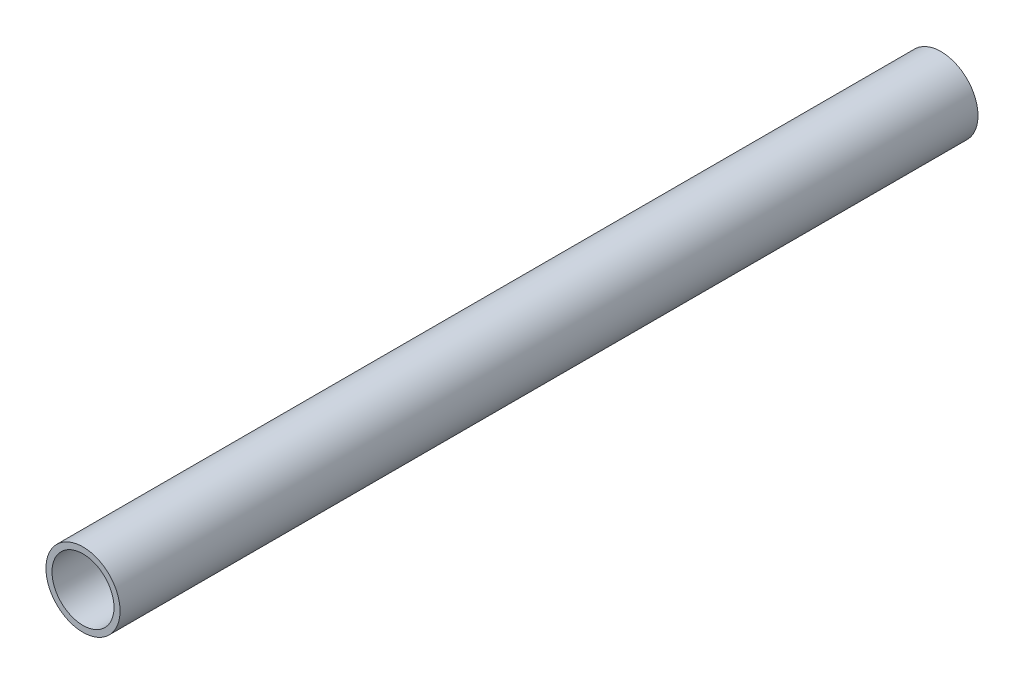
ISO-10303-21;
HEADER;
FILE_DESCRIPTION(('STEP AP214'),'2;1');
FILE_NAME('part.step','',(''),(''),'','','');
FILE_SCHEMA(('AUTOMOTIVE_DESIGN { 1 0 10303 214 1 1 1 1 }'));
ENDSEC;
DATA;
#1=APPLICATION_CONTEXT('core data for automotive mechanical design processes');
#2=APPLICATION_PROTOCOL_DEFINITION('international standard','automotive_design',2000,#1);
#3=PRODUCT_CONTEXT('',#1,'mechanical');
#4=PRODUCT('Part','Part','',(#3));
#5=PRODUCT_RELATED_PRODUCT_CATEGORY('part','',(#4));
#6=PRODUCT_DEFINITION_FORMATION('','',#4);
#7=PRODUCT_DEFINITION_CONTEXT('part definition',#1,'design');
#8=PRODUCT_DEFINITION('design','',#6,#7);
#9=PRODUCT_DEFINITION_SHAPE('','',#8);
#10=(LENGTH_UNIT() NAMED_UNIT(*) SI_UNIT(.MILLI.,.METRE.));
#11=(NAMED_UNIT(*) PLANE_ANGLE_UNIT() SI_UNIT($,.RADIAN.));
#12=(NAMED_UNIT(*) SI_UNIT($,.STERADIAN.) SOLID_ANGLE_UNIT());
#13=UNCERTAINTY_MEASURE_WITH_UNIT(LENGTH_MEASURE(1.E-05),#10,'distance_accuracy_value','');
#14=(GEOMETRIC_REPRESENTATION_CONTEXT(3) GLOBAL_UNCERTAINTY_ASSIGNED_CONTEXT((#13)) GLOBAL_UNIT_ASSIGNED_CONTEXT((#10,
#11,#12)) REPRESENTATION_CONTEXT('',''));
#15=CARTESIAN_POINT('',(0.,0.,0.));
#16=DIRECTION('',(0.,0.,1.));
#17=DIRECTION('',(1.,0.,0.));
#18=AXIS2_PLACEMENT_3D('',#15,#16,#17);
#19=CARTESIAN_POINT('',(0.,0.,558.8));
#20=DIRECTION('',(0.,0.,1.));
#21=DIRECTION('',(1.,0.,0.));
#22=AXIS2_PLACEMENT_3D('',#19,#20,#21);
#23=PLANE('',#22);
#24=CARTESIAN_POINT('',(0.,0.,558.8));
#25=DIRECTION('',(0.,0.,1.));
#26=DIRECTION('',(1.,0.,0.));
#27=AXIS2_PLACEMENT_3D('',#24,#25,#26);
#28=CIRCLE('',#27,24.13);
#29=CARTESIAN_POINT('',(24.13,0.,558.8));
#30=VERTEX_POINT('',#29);
#31=EDGE_CURVE('E10',#30,#30,#28,.T.);
#32=ORIENTED_EDGE('',*,*,#31,.T.);
#33=EDGE_LOOP('',(#32));
#34=FACE_BOUND('',#33,.T.);
#35=CARTESIAN_POINT('',(0.,0.,558.8));
#36=DIRECTION('',(0.,0.,1.));
#37=DIRECTION('',(1.,0.,0.));
#38=AXIS2_PLACEMENT_3D('',#35,#36,#37);
#39=CIRCLE('',#38,20.193);
#40=CARTESIAN_POINT('',(20.193,0.,558.8));
#41=VERTEX_POINT('',#40);
#42=EDGE_CURVE('E42',#41,#41,#39,.T.);
#43=ORIENTED_EDGE('',*,*,#42,.F.);
#44=EDGE_LOOP('',(#43));
#45=FACE_BOUND('',#44,.T.);
#46=ADVANCED_FACE('F31',(#34,#45),#23,.T.);
#47=CARTESIAN_POINT('',(0.,0.,0.));
#48=DIRECTION('',(0.,0.,1.));
#49=DIRECTION('',(1.,0.,0.));
#50=AXIS2_PLACEMENT_3D('',#47,#48,#49);
#51=PLANE('',#50);
#52=CARTESIAN_POINT('',(0.,0.,0.));
#53=DIRECTION('',(0.,0.,1.));
#54=DIRECTION('',(1.,0.,0.));
#55=AXIS2_PLACEMENT_3D('',#52,#53,#54);
#56=CIRCLE('',#55,24.13);
#57=CARTESIAN_POINT('',(24.13,0.,0.));
#58=VERTEX_POINT('',#57);
#59=EDGE_CURVE('E35',#58,#58,#56,.T.);
#60=ORIENTED_EDGE('',*,*,#59,.F.);
#61=EDGE_LOOP('',(#60));
#62=FACE_BOUND('',#61,.T.);
#63=CARTESIAN_POINT('',(0.,0.,0.));
#64=DIRECTION('',(0.,0.,1.));
#65=DIRECTION('',(1.,0.,0.));
#66=AXIS2_PLACEMENT_3D('',#63,#64,#65);
#67=CIRCLE('',#66,20.193);
#68=CARTESIAN_POINT('',(20.193,0.,0.));
#69=VERTEX_POINT('',#68);
#70=EDGE_CURVE('E44',#69,#69,#67,.T.);
#71=ORIENTED_EDGE('',*,*,#70,.T.);
#72=EDGE_LOOP('',(#71));
#73=FACE_BOUND('',#72,.T.);
#74=ADVANCED_FACE('F54',(#62,#73),#51,.F.);
#75=CARTESIAN_POINT('',(0.,0.,558.8));
#76=DIRECTION('',(0.,0.,-1.));
#77=DIRECTION('',(-1.,0.,0.));
#78=AXIS2_PLACEMENT_3D('',#75,#76,#77);
#79=CYLINDRICAL_SURFACE('',#78,24.13);
#80=ORIENTED_EDGE('',*,*,#31,.F.);
#81=EDGE_LOOP('',(#80));
#82=FACE_BOUND('',#81,.T.);
#83=ORIENTED_EDGE('',*,*,#59,.T.);
#84=EDGE_LOOP('',(#83));
#85=FACE_BOUND('',#84,.T.);
#86=ADVANCED_FACE('F33',(#82,#85),#79,.T.);
#87=CARTESIAN_POINT('',(0.,0.,558.8));
#88=DIRECTION('',(0.,0.,-1.));
#89=DIRECTION('',(-1.,0.,0.));
#90=AXIS2_PLACEMENT_3D('',#87,#88,#89);
#91=CYLINDRICAL_SURFACE('',#90,20.193);
#92=ORIENTED_EDGE('',*,*,#42,.T.);
#93=EDGE_LOOP('',(#92));
#94=FACE_BOUND('',#93,.T.);
#95=ORIENTED_EDGE('',*,*,#70,.F.);
#96=EDGE_LOOP('',(#95));
#97=FACE_BOUND('',#96,.T.);
#98=ADVANCED_FACE('F50',(#94,#97),#91,.F.);
#99=CLOSED_SHELL('',(#46,#74,#86,#98));
#100=MANIFOLD_SOLID_BREP('B2',#99);
#101=ADVANCED_BREP_SHAPE_REPRESENTATION('',(#18,#100),#14);
#102=SHAPE_DEFINITION_REPRESENTATION(#9,#101);
ENDSEC;
END-ISO-10303-21;
